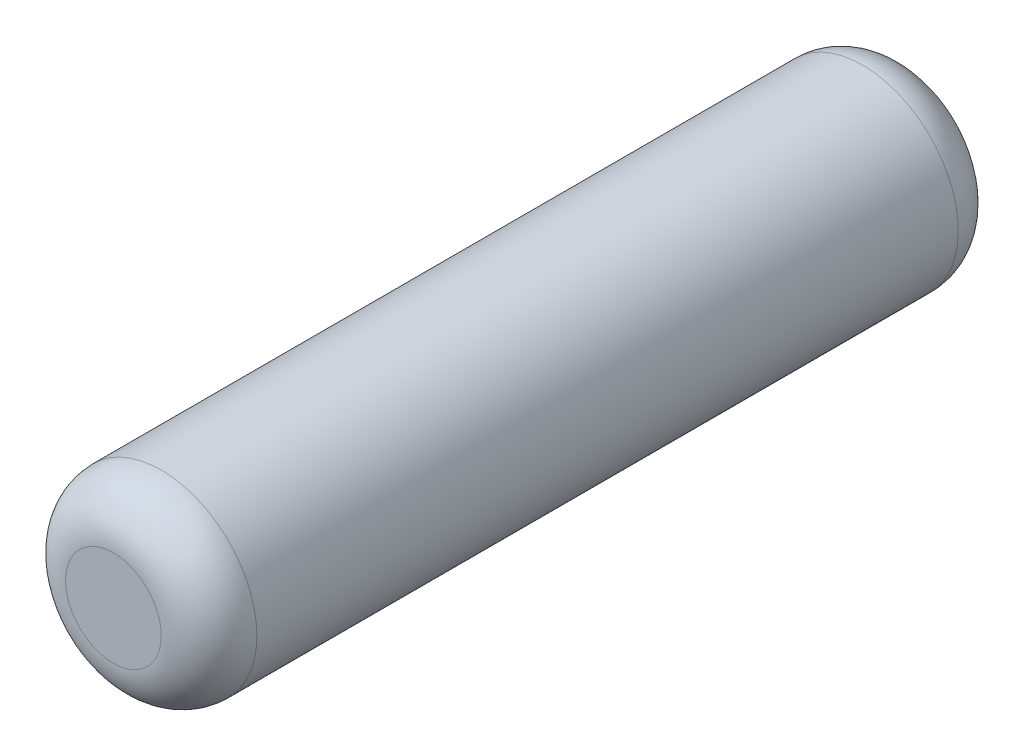
ISO-10303-21;
HEADER;
FILE_DESCRIPTION(('STEP AP214'),'2;1');
FILE_NAME('part.step','',(''),(''),'','','');
FILE_SCHEMA(('AUTOMOTIVE_DESIGN { 1 0 10303 214 1 1 1 1 }'));
ENDSEC;
DATA;
#1=APPLICATION_CONTEXT('core data for automotive mechanical design processes');
#2=APPLICATION_PROTOCOL_DEFINITION('international standard','automotive_design',2000,#1);
#3=PRODUCT_CONTEXT('',#1,'mechanical');
#4=PRODUCT('Part','Part','',(#3));
#5=PRODUCT_RELATED_PRODUCT_CATEGORY('part','',(#4));
#6=PRODUCT_DEFINITION_FORMATION('','',#4);
#7=PRODUCT_DEFINITION_CONTEXT('part definition',#1,'design');
#8=PRODUCT_DEFINITION('design','',#6,#7);
#9=PRODUCT_DEFINITION_SHAPE('','',#8);
#10=(LENGTH_UNIT() NAMED_UNIT(*) SI_UNIT(.MILLI.,.METRE.));
#11=(NAMED_UNIT(*) PLANE_ANGLE_UNIT() SI_UNIT($,.RADIAN.));
#12=(NAMED_UNIT(*) SI_UNIT($,.STERADIAN.) SOLID_ANGLE_UNIT());
#13=UNCERTAINTY_MEASURE_WITH_UNIT(LENGTH_MEASURE(1.E-05),#10,'distance_accuracy_value','');
#14=(GEOMETRIC_REPRESENTATION_CONTEXT(3) GLOBAL_UNCERTAINTY_ASSIGNED_CONTEXT((#13)) GLOBAL_UNIT_ASSIGNED_CONTEXT((#10,
#11,#12)) REPRESENTATION_CONTEXT('',''));
#15=CARTESIAN_POINT('',(0.,0.,0.));
#16=DIRECTION('',(0.,0.,1.));
#17=DIRECTION('',(1.,0.,0.));
#18=AXIS2_PLACEMENT_3D('',#15,#16,#17);
#19=CARTESIAN_POINT('',(0.,0.,25.));
#20=DIRECTION('',(0.,0.,-1.));
#21=DIRECTION('',(-1.,0.,0.));
#22=AXIS2_PLACEMENT_3D('',#19,#20,#21);
#23=CYLINDRICAL_SURFACE('',#22,3.);
#24=CARTESIAN_POINT('',(0.,0.,1.5));
#25=DIRECTION('',(0.,0.,1.));
#26=DIRECTION('',(1.,0.,0.));
#27=AXIS2_PLACEMENT_3D('',#24,#25,#26);
#28=CIRCLE('',#27,3.);
#29=CARTESIAN_POINT('',(3.,0.,1.5));
#30=VERTEX_POINT('',#29);
#31=EDGE_CURVE('E50',#30,#30,#28,.T.);
#32=ORIENTED_EDGE('',*,*,#31,.T.);
#33=EDGE_LOOP('',(#32));
#34=FACE_BOUND('',#33,.T.);
#35=CARTESIAN_POINT('',(0.,0.,23.5));
#36=DIRECTION('',(0.,0.,1.));
#37=DIRECTION('',(1.,0.,0.));
#38=AXIS2_PLACEMENT_3D('',#35,#36,#37);
#39=CIRCLE('',#38,3.);
#40=CARTESIAN_POINT('',(3.,0.,23.5));
#41=VERTEX_POINT('',#40);
#42=EDGE_CURVE('E55',#41,#41,#39,.F.);
#43=ORIENTED_EDGE('',*,*,#42,.T.);
#44=EDGE_LOOP('',(#43));
#45=FACE_BOUND('',#44,.T.);
#46=ADVANCED_FACE('F37',(#34,#45),#23,.T.);
#47=CARTESIAN_POINT('',(0.,0.,25.));
#48=DIRECTION('',(0.,0.,1.));
#49=DIRECTION('',(1.,0.,0.));
#50=AXIS2_PLACEMENT_3D('',#47,#48,#49);
#51=PLANE('',#50);
#52=CARTESIAN_POINT('',(0.,0.,25.));
#53=DIRECTION('',(0.,0.,1.));
#54=DIRECTION('',(1.,0.,0.));
#55=AXIS2_PLACEMENT_3D('',#52,#53,#54);
#56=CIRCLE('',#55,1.5);
#57=CARTESIAN_POINT('',(1.5,0.,25.));
#58=VERTEX_POINT('',#57);
#59=EDGE_CURVE('E10',#58,#58,#56,.T.);
#60=ORIENTED_EDGE('',*,*,#59,.T.);
#61=EDGE_LOOP('',(#60));
#62=FACE_BOUND('',#61,.T.);
#63=ADVANCED_FACE('F72',(#62),#51,.T.);
#64=CARTESIAN_POINT('',(0.,0.,0.));
#65=DIRECTION('',(0.,0.,1.));
#66=DIRECTION('',(1.,0.,0.));
#67=AXIS2_PLACEMENT_3D('',#64,#65,#66);
#68=PLANE('',#67);
#69=CARTESIAN_POINT('',(0.,0.,0.));
#70=DIRECTION('',(0.,0.,1.));
#71=DIRECTION('',(1.,0.,0.));
#72=AXIS2_PLACEMENT_3D('',#69,#70,#71);
#73=CIRCLE('',#72,1.5);
#74=CARTESIAN_POINT('',(1.5,0.,0.));
#75=VERTEX_POINT('',#74);
#76=EDGE_CURVE('E45',#75,#75,#73,.F.);
#77=ORIENTED_EDGE('',*,*,#76,.T.);
#78=EDGE_LOOP('',(#77));
#79=FACE_BOUND('',#78,.T.);
#80=ADVANCED_FACE('F69',(#79),#68,.F.);
#81=CARTESIAN_POINT('',(0.,0.,1.5));
#82=DIRECTION('',(0.,0.,1.));
#83=DIRECTION('',(1.,0.,0.));
#84=AXIS2_PLACEMENT_3D('',#81,#82,#83);
#85=TOROIDAL_SURFACE('',#84,1.5,1.5);
#86=ORIENTED_EDGE('',*,*,#76,.F.);
#87=EDGE_LOOP('',(#86));
#88=FACE_BOUND('',#87,.T.);
#89=ORIENTED_EDGE('',*,*,#31,.F.);
#90=EDGE_LOOP('',(#89));
#91=FACE_BOUND('',#90,.T.);
#92=ADVANCED_FACE('F65',(#88,#91),#85,.T.);
#93=CARTESIAN_POINT('',(0.,0.,23.5));
#94=DIRECTION('',(0.,0.,1.));
#95=DIRECTION('',(1.,0.,0.));
#96=AXIS2_PLACEMENT_3D('',#93,#94,#95);
#97=TOROIDAL_SURFACE('',#96,1.5,1.5);
#98=ORIENTED_EDGE('',*,*,#42,.F.);
#99=EDGE_LOOP('',(#98));
#100=FACE_BOUND('',#99,.T.);
#101=ORIENTED_EDGE('',*,*,#59,.F.);
#102=EDGE_LOOP('',(#101));
#103=FACE_BOUND('',#102,.T.);
#104=ADVANCED_FACE('F39',(#100,#103),#97,.T.);
#105=CLOSED_SHELL('',(#46,#63,#80,#92,#104));
#106=MANIFOLD_SOLID_BREP('B2',#105);
#107=ADVANCED_BREP_SHAPE_REPRESENTATION('',(#18,#106),#14);
#108=SHAPE_DEFINITION_REPRESENTATION(#9,#107);
ENDSEC;
END-ISO-10303-21;
